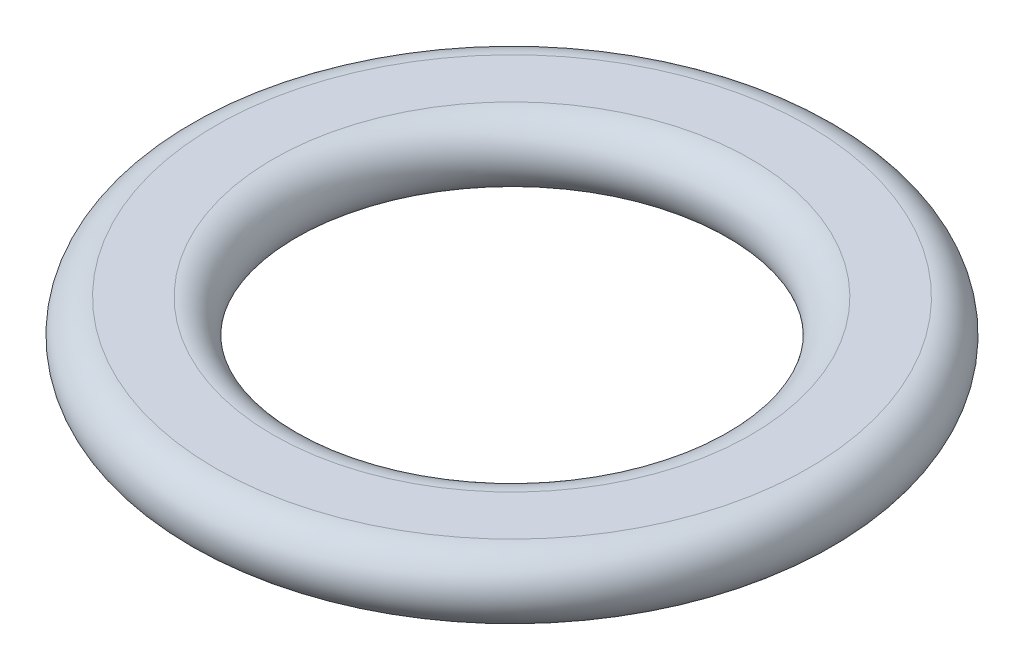
ISO-10303-21;
HEADER;
FILE_DESCRIPTION(('STEP AP214'),'2;1');
FILE_NAME('part.step','',(''),(''),'','','');
FILE_SCHEMA(('AUTOMOTIVE_DESIGN { 1 0 10303 214 1 1 1 1 }'));
ENDSEC;
DATA;
#1=APPLICATION_CONTEXT('core data for automotive mechanical design processes');
#2=APPLICATION_PROTOCOL_DEFINITION('international standard','automotive_design',2000,#1);
#3=PRODUCT_CONTEXT('',#1,'mechanical');
#4=PRODUCT('Part','Part','',(#3));
#5=PRODUCT_RELATED_PRODUCT_CATEGORY('part','',(#4));
#6=PRODUCT_DEFINITION_FORMATION('','',#4);
#7=PRODUCT_DEFINITION_CONTEXT('part definition',#1,'design');
#8=PRODUCT_DEFINITION('design','',#6,#7);
#9=PRODUCT_DEFINITION_SHAPE('','',#8);
#10=(LENGTH_UNIT() NAMED_UNIT(*) SI_UNIT(.MILLI.,.METRE.));
#11=(NAMED_UNIT(*) PLANE_ANGLE_UNIT() SI_UNIT($,.RADIAN.));
#12=(NAMED_UNIT(*) SI_UNIT($,.STERADIAN.) SOLID_ANGLE_UNIT());
#13=UNCERTAINTY_MEASURE_WITH_UNIT(LENGTH_MEASURE(1.E-05),#10,'distance_accuracy_value','');
#14=(GEOMETRIC_REPRESENTATION_CONTEXT(3) GLOBAL_UNCERTAINTY_ASSIGNED_CONTEXT((#13)) GLOBAL_UNIT_ASSIGNED_CONTEXT((#10,
#11,#12)) REPRESENTATION_CONTEXT('',''));
#15=CARTESIAN_POINT('',(0.,0.,0.));
#16=DIRECTION('',(0.,0.,1.));
#17=DIRECTION('',(1.,0.,0.));
#18=AXIS2_PLACEMENT_3D('',#15,#16,#17);
#19=CARTESIAN_POINT('',(0.,0.,0.));
#20=DIRECTION('',(0.,1.,0.));
#21=DIRECTION('',(0.,0.,1.));
#22=AXIS2_PLACEMENT_3D('',#19,#20,#21);
#23=TOROIDAL_SURFACE('',#22,2.9,0.4);
#24=CARTESIAN_POINT('',(0.,-0.4,0.));
#25=DIRECTION('',(0.,1.,0.));
#26=DIRECTION('',(0.,0.,1.));
#27=AXIS2_PLACEMENT_3D('',#24,#25,#26);
#28=CIRCLE('',#27,2.9);
#29=CARTESIAN_POINT('',(0.,-0.4,2.9));
#30=VERTEX_POINT('',#29);
#31=EDGE_CURVE('E10',#30,#30,#28,.T.);
#32=ORIENTED_EDGE('',*,*,#31,.F.);
#33=EDGE_LOOP('',(#32));
#34=FACE_BOUND('',#33,.T.);
#35=CARTESIAN_POINT('',(0.,0.4,0.));
#36=DIRECTION('',(0.,1.,0.));
#37=DIRECTION('',(0.,0.,1.));
#38=AXIS2_PLACEMENT_3D('',#35,#36,#37);
#39=CIRCLE('',#38,2.9);
#40=CARTESIAN_POINT('',(0.,0.4,2.9));
#41=VERTEX_POINT('',#40);
#42=EDGE_CURVE('E45',#41,#41,#39,.T.);
#43=ORIENTED_EDGE('',*,*,#42,.T.);
#44=EDGE_LOOP('',(#43));
#45=FACE_BOUND('',#44,.T.);
#46=ADVANCED_FACE('F31',(#34,#45),#23,.T.);
#47=CARTESIAN_POINT('',(2.9,-0.4,0.));
#48=DIRECTION('',(0.,1.,0.));
#49=DIRECTION('',(0.,0.,1.));
#50=AXIS2_PLACEMENT_3D('',#47,#48,#49);
#51=PLANE('',#50);
#52=CARTESIAN_POINT('',(0.,-0.4,0.));
#53=DIRECTION('',(0.,1.,0.));
#54=DIRECTION('',(0.,0.,1.));
#55=AXIS2_PLACEMENT_3D('',#52,#53,#54);
#56=CIRCLE('',#55,3.6);
#57=CARTESIAN_POINT('',(0.,-0.4,3.6));
#58=VERTEX_POINT('',#57);
#59=EDGE_CURVE('E37',#58,#58,#56,.T.);
#60=ORIENTED_EDGE('',*,*,#59,.F.);
#61=EDGE_LOOP('',(#60));
#62=FACE_BOUND('',#61,.T.);
#63=ORIENTED_EDGE('',*,*,#31,.T.);
#64=EDGE_LOOP('',(#63));
#65=FACE_BOUND('',#64,.T.);
#66=ADVANCED_FACE('F60',(#62,#65),#51,.F.);
#67=CARTESIAN_POINT('',(0.,0.,0.));
#68=DIRECTION('',(0.,1.,0.));
#69=DIRECTION('',(0.,0.,1.));
#70=AXIS2_PLACEMENT_3D('',#67,#68,#69);
#71=TOROIDAL_SURFACE('',#70,3.6,0.4);
#72=CARTESIAN_POINT('',(0.,0.4,0.));
#73=DIRECTION('',(0.,1.,0.));
#74=DIRECTION('',(0.,0.,1.));
#75=AXIS2_PLACEMENT_3D('',#72,#73,#74);
#76=CIRCLE('',#75,3.6);
#77=CARTESIAN_POINT('',(0.,0.4,3.6));
#78=VERTEX_POINT('',#77);
#79=EDGE_CURVE('E41',#78,#78,#76,.T.);
#80=ORIENTED_EDGE('',*,*,#79,.F.);
#81=EDGE_LOOP('',(#80));
#82=FACE_BOUND('',#81,.T.);
#83=ORIENTED_EDGE('',*,*,#59,.T.);
#84=EDGE_LOOP('',(#83));
#85=FACE_BOUND('',#84,.T.);
#86=ADVANCED_FACE('F55',(#82,#85),#71,.T.);
#87=CARTESIAN_POINT('',(2.9,0.4,0.));
#88=DIRECTION('',(0.,-1.,0.));
#89=DIRECTION('',(0.,0.,-1.));
#90=AXIS2_PLACEMENT_3D('',#87,#88,#89);
#91=PLANE('',#90);
#92=ORIENTED_EDGE('',*,*,#42,.F.);
#93=EDGE_LOOP('',(#92));
#94=FACE_BOUND('',#93,.T.);
#95=ORIENTED_EDGE('',*,*,#79,.T.);
#96=EDGE_LOOP('',(#95));
#97=FACE_BOUND('',#96,.T.);
#98=ADVANCED_FACE('F52',(#94,#97),#91,.F.);
#99=CLOSED_SHELL('',(#46,#66,#86,#98));
#100=MANIFOLD_SOLID_BREP('B2',#99);
#101=ADVANCED_BREP_SHAPE_REPRESENTATION('',(#18,#100),#14);
#102=SHAPE_DEFINITION_REPRESENTATION(#9,#101);
ENDSEC;
END-ISO-10303-21;
